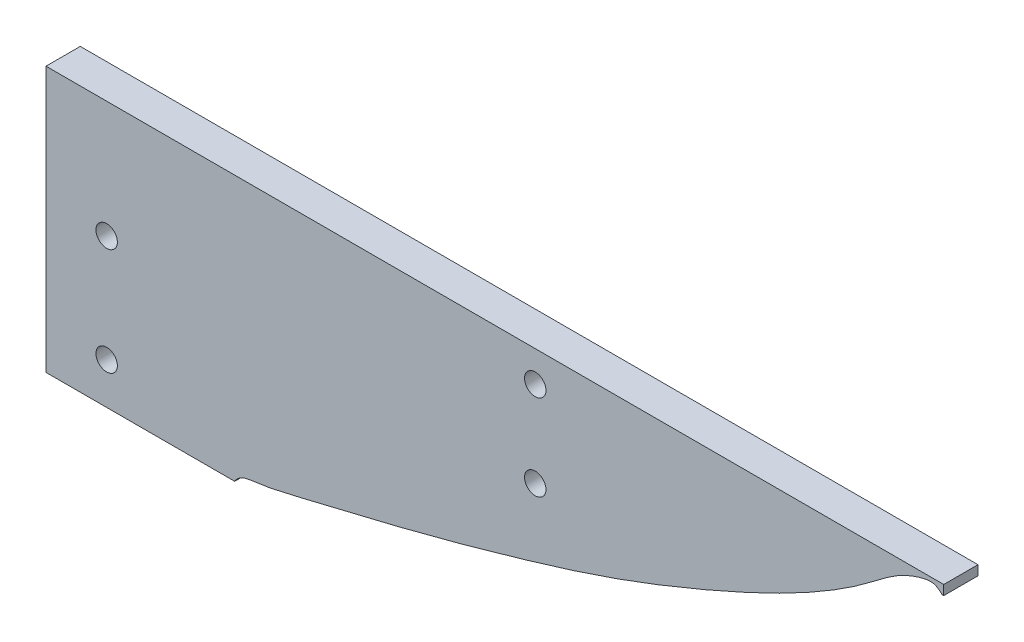
ISO-10303-21;
HEADER;
FILE_DESCRIPTION(('STEP AP214'),'2;1');
FILE_NAME('part.step','',(''),(''),'','','');
FILE_SCHEMA(('AUTOMOTIVE_DESIGN { 1 0 10303 214 1 1 1 1 }'));
ENDSEC;
DATA;
#1=APPLICATION_CONTEXT('core data for automotive mechanical design processes');
#2=APPLICATION_PROTOCOL_DEFINITION('international standard','automotive_design',2000,#1);
#3=PRODUCT_CONTEXT('',#1,'mechanical');
#4=PRODUCT('Part','Part','',(#3));
#5=PRODUCT_RELATED_PRODUCT_CATEGORY('part','',(#4));
#6=PRODUCT_DEFINITION_FORMATION('','',#4);
#7=PRODUCT_DEFINITION_CONTEXT('part definition',#1,'design');
#8=PRODUCT_DEFINITION('design','',#6,#7);
#9=PRODUCT_DEFINITION_SHAPE('','',#8);
#10=(LENGTH_UNIT() NAMED_UNIT(*) SI_UNIT(.MILLI.,.METRE.));
#11=(NAMED_UNIT(*) PLANE_ANGLE_UNIT() SI_UNIT($,.RADIAN.));
#12=(NAMED_UNIT(*) SI_UNIT($,.STERADIAN.) SOLID_ANGLE_UNIT());
#13=UNCERTAINTY_MEASURE_WITH_UNIT(LENGTH_MEASURE(1.E-05),#10,'distance_accuracy_value','');
#14=(GEOMETRIC_REPRESENTATION_CONTEXT(3) GLOBAL_UNCERTAINTY_ASSIGNED_CONTEXT((#13)) GLOBAL_UNIT_ASSIGNED_CONTEXT((#10,
#11,#12)) REPRESENTATION_CONTEXT('',''));
#15=CARTESIAN_POINT('',(0.,0.,0.));
#16=DIRECTION('',(0.,0.,1.));
#17=DIRECTION('',(1.,0.,0.));
#18=AXIS2_PLACEMENT_3D('',#15,#16,#17);
#19=CARTESIAN_POINT('',(-92.1335838005074,-59.6771100922641,236.));
#20=DIRECTION('',(0.,0.,-1.));
#21=DIRECTION('',(-1.,0.,0.));
#22=AXIS2_PLACEMENT_3D('',#19,#20,#21);
#23=PLANE('',#22);
#24=CARTESIAN_POINT('',(-100.,-50.,236.));
#25=DIRECTION('',(0.,0.,-1.));
#26=DIRECTION('',(-1.,0.,0.));
#27=AXIS2_PLACEMENT_3D('',#24,#25,#26);
#28=CIRCLE('',#27,2.5);
#29=CARTESIAN_POINT('',(-102.5,-50.,236.));
#30=VERTEX_POINT('',#29);
#31=EDGE_CURVE('E207',#30,#30,#28,.F.);
#32=ORIENTED_EDGE('',*,*,#31,.F.);
#33=EDGE_LOOP('',(#32));
#34=FACE_BOUND('',#33,.T.);
#35=CARTESIAN_POINT('',(0.0705666698621599,-4.96037406111782,236.));
#36=DIRECTION('',(0.,0.,-1.));
#37=DIRECTION('',(-1.,0.,0.));
#38=AXIS2_PLACEMENT_3D('',#35,#36,#37);
#39=CIRCLE('',#38,2.5);
#40=CARTESIAN_POINT('',(-2.42943333013784,-4.96037406111782,236.));
#41=VERTEX_POINT('',#40);
#42=EDGE_CURVE('E203',#41,#41,#39,.F.);
#43=ORIENTED_EDGE('',*,*,#42,.F.);
#44=EDGE_LOOP('',(#43));
#45=FACE_BOUND('',#44,.T.);
#46=CARTESIAN_POINT('',(-70.1025901875895,-59.6684176574879,236.));
#47=CARTESIAN_POINT('',(-84.7899186560649,-59.6754955178742,236.));
#48=CARTESIAN_POINT('',(-99.4772485604959,-59.6799394189889,236.));
#49=CARTESIAN_POINT('',(-114.164578566787,-59.682158270036,236.));
#50=B_SPLINE_CURVE_WITH_KNOTS('',3,(#46,#47,#48,#49),.UNSPECIFIED.,.F.,.F.,(4,4),(0.,1.),.UNSPECIFIED.);
#51=CARTESIAN_POINT('',(-114.164578566787,-59.682158270036,236.));
#52=VERTEX_POINT('',#51);
#53=CARTESIAN_POINT('',(-70.1025901875894,-59.668417657488,236.));
#54=VERTEX_POINT('',#53);
#55=EDGE_CURVE('E161',#52,#54,#50,.F.);
#56=ORIENTED_EDGE('',*,*,#55,.T.);
#57=CARTESIAN_POINT('',(95.0098967569557,-1.11062960043984E-13,236.));
#58=CARTESIAN_POINT('',(94.9646348912785,0.110528165147327,236.));
#59=CARTESIAN_POINT('',(94.8858730942533,0.201338484194809,236.));
#60=CARTESIAN_POINT('',(94.707948532264,0.357925164368955,236.));
#61=CARTESIAN_POINT('',(94.6121065440396,0.426979239515736,236.));
#62=CARTESIAN_POINT('',(94.3258286318335,0.635817566425945,236.));
#63=CARTESIAN_POINT('',(94.1394870668036,0.781789145604218,236.));
#64=CARTESIAN_POINT('',(93.8389060311838,0.970306379640372,236.));
#65=CARTESIAN_POINT('',(93.7367966341006,1.02877239486765,236.));
#66=CARTESIAN_POINT('',(93.5254089320287,1.12933976440624,236.));
#67=CARTESIAN_POINT('',(93.4157519255615,1.17057664656028,236.));
#68=CARTESIAN_POINT('',(93.1889723611007,1.23600859349705,236.));
#69=CARTESIAN_POINT('',(93.0717956642538,1.2602257044401,236.));
#70=CARTESIAN_POINT('',(92.8387829712304,1.29371998452372,236.));
#71=CARTESIAN_POINT('',(92.7219141891853,1.30335606876022,236.));
#72=CARTESIAN_POINT('',(92.370530206683,1.31700694439368,236.));
#73=CARTESIAN_POINT('',(92.134388676331,1.30626586552627,236.));
#74=CARTESIAN_POINT('',(91.6651232386488,1.26320279822102,236.));
#75=CARTESIAN_POINT('',(91.4329447789381,1.23192509387219,236.));
#76=CARTESIAN_POINT('',(90.7425854142331,1.11356625325394,236.));
#77=CARTESIAN_POINT('',(90.2907662999897,1.00122164833865,236.));
#78=CARTESIAN_POINT('',(88.9471475329473,0.617175365341938,236.));
#79=CARTESIAN_POINT('',(88.0630947138927,0.293935829080739,236.));
#80=CARTESIAN_POINT('',(86.354647861762,-0.442154647152451,236.));
#81=CARTESIAN_POINT('',(85.5287307014704,-0.857590972166905,236.));
#82=CARTESIAN_POINT('',(83.133035651573,-2.24128095967102,236.));
#83=CARTESIAN_POINT('',(81.6414485885241,-3.34044373908866,236.));
#84=CARTESIAN_POINT('',(79.4236390416994,-5.02195426573998,236.));
#85=CARTESIAN_POINT('',(78.687085371114,-5.58678754026477,236.));
#86=CARTESIAN_POINT('',(77.2027585566427,-6.69885319920604,236.));
#87=CARTESIAN_POINT('',(76.4563045701257,-7.24818752093762,236.));
#88=CARTESIAN_POINT('',(74.1929633514125,-8.85875375730449,236.));
#89=CARTESIAN_POINT('',(72.6509541833982,-9.8807649815716,236.));
#90=CARTESIAN_POINT('',(69.5219935181907,-11.8546228858641,236.));
#91=CARTESIAN_POINT('',(67.9355503859993,-12.80726323189,236.));
#92=CARTESIAN_POINT('',(64.7298052508904,-14.6612442309594,236.));
#93=CARTESIAN_POINT('',(63.1100013703178,-15.5620888409973,236.));
#94=CARTESIAN_POINT('',(59.8370994369851,-17.3106264463568,236.));
#95=CARTESIAN_POINT('',(58.1870022863528,-18.1576003044908,236.));
#96=CARTESIAN_POINT('',(54.865297217835,-19.8085224246815,236.));
#97=CARTESIAN_POINT('',(53.1936533501743,-20.6126409497683,236.));
#98=CARTESIAN_POINT('',(49.8357054322329,-22.1905343956482,236.));
#99=CARTESIAN_POINT('',(48.1499613025603,-22.9638846339254,236.));
#100=CARTESIAN_POINT('',(43.0750662037871,-25.2432456536307,236.));
#101=CARTESIAN_POINT('',(39.6688273042364,-26.7098908626203,236.));
#102=CARTESIAN_POINT('',(32.8179285862304,-29.5546707690006,236.));
#103=CARTESIAN_POINT('',(29.3729537534523,-30.9332543927951,236.));
#104=CARTESIAN_POINT('',(22.441303784926,-33.5782241800503,236.));
#105=CARTESIAN_POINT('',(18.9518243120829,-34.8402287007629,236.));
#106=CARTESIAN_POINT('',(11.9327285142029,-37.236064589227,236.));
#107=CARTESIAN_POINT('',(8.40266147210957,-38.3716393149871,236.));
#108=CARTESIAN_POINT('',(1.31631471382787,-40.5631469191048,236.));
#109=CARTESIAN_POINT('',(-2.2389650556304,-41.6222062183926,236.));
#110=CARTESIAN_POINT('',(-9.36163748023725,-43.6942731896203,236.));
#111=CARTESIAN_POINT('',(-12.9294966205001,-44.707455214369,236.));
#112=CARTESIAN_POINT('',(-20.0819381780462,-46.6752334090556,236.));
#113=CARTESIAN_POINT('',(-23.6667096442574,-47.6291582090685,236.));
#114=CARTESIAN_POINT('',(-34.4424742352563,-50.4058260472047,236.));
#115=CARTESIAN_POINT('',(-41.6551264096028,-52.1441386894933,236.));
#116=CARTESIAN_POINT('',(-50.6722184590445,-54.309039395931,236.));
#117=CARTESIAN_POINT('',(-52.4760057514306,-54.7405027829286,236.));
#118=CARTESIAN_POINT('',(-55.1833790678676,-55.3805250229289,236.));
#119=CARTESIAN_POINT('',(-56.0861252476857,-55.5926445734478,236.));
#120=CARTESIAN_POINT('',(-57.8921506389536,-56.0146266742834,236.));
#121=CARTESIAN_POINT('',(-58.7948901230761,-56.2269085061191,236.));
#122=CARTESIAN_POINT('',(-60.6039265474955,-56.634904518819,236.));
#123=CARTESIAN_POINT('',(-61.5108628096882,-56.8276542929522,236.));
#124=CARTESIAN_POINT('',(-62.8802997978888,-57.0747613259844,236.));
#125=CARTESIAN_POINT('',(-63.3382214245906,-57.150421442323,236.));
#126=CARTESIAN_POINT('',(-64.2569213186157,-57.2871155661889,236.));
#127=CARTESIAN_POINT('',(-64.7182060518271,-57.345783776302,236.));
#128=CARTESIAN_POINT('',(-65.6420492864172,-57.4567481160613,236.));
#129=CARTESIAN_POINT('',(-66.1039394129418,-57.5123878198849,236.));
#130=CARTESIAN_POINT('',(-67.0196061106396,-57.6642556398476,236.));
#131=CARTESIAN_POINT('',(-67.4743218544864,-57.7557855039794,236.));
#132=CARTESIAN_POINT('',(-68.1398061915465,-57.9760688859622,236.));
#133=CARTESIAN_POINT('',(-68.3587343136876,-58.0640040066889,236.));
#134=CARTESIAN_POINT('',(-68.6796419539271,-58.2333484384033,236.));
#135=CARTESIAN_POINT('',(-68.7851365366851,-58.296219802004,236.));
#136=CARTESIAN_POINT('',(-68.9848123366182,-58.4320827070422,236.));
#137=CARTESIAN_POINT('',(-69.0801823846164,-58.5053113500221,236.));
#138=CARTESIAN_POINT('',(-69.3575456460325,-58.7353677888363,236.));
#139=CARTESIAN_POINT('',(-69.5279401697686,-58.9059472641748,236.));
#140=CARTESIAN_POINT('',(-69.7801517860728,-59.165824085469,236.));
#141=CARTESIAN_POINT('',(-69.8633981038015,-59.2538774120878,236.));
#142=CARTESIAN_POINT('',(-70.0117362489369,-59.4444338368955,236.));
#143=CARTESIAN_POINT('',(-70.0755741246069,-59.550308596245,236.));
#144=CARTESIAN_POINT('',(-70.1025901875894,-59.668417657488,236.));
#145=B_SPLINE_CURVE_WITH_KNOTS('',3,(#57,#58,#59,#60,#61,#62,#63,#64,#65,#66,#67,#68,#69,#70,
#71,#72,#73,#74,#75,#76,#77,#78,#79,#80,#81,#82,#83,#84,#85,#86,#87,#88,#89,#90,#91,#92,#93,#94,
#95,#96,#97,#98,#99,#100,#101,#102,#103,#104,#105,#106,#107,#108,#109,#110,#111,#112,#113,#114,
#115,#116,#117,#118,#119,#120,#121,#122,#123,#124,#125,#126,#127,#128,#129,#130,#131,#132,#133,
#134,#135,#136,#137,#138,#139,#140,#141,#142,#143,#144),.UNSPECIFIED.,.F.,.F.,(4,2,2,2,2,2,2,2,
2,2,2,2,2,2,2,2,2,2,2,2,2,2,2,2,2,2,2,2,2,2,2,2,2,2,2,2,2,2,2,2,2,2,2,4),(0.,
0.00195312499999978,0.00390624999999956,0.00781249999999933,0.00976562499999922,
0.0117187499999991,0.013671874999999,0.0156249999999989,0.0195312499999989,0.0234374999999989,
0.0312499999999989,0.0468749999999989,0.0624999999999989,0.0937499999999987,0.109374999999999,
0.124999999999998,0.156249999999998,0.187499999999998,0.218749999999998,0.249999999999998,
0.281249999999999,0.312499999999999,0.374999999999999,0.437499999999999,0.499999999999999,
0.562499999999999,0.624999999999999,0.687499999999999,0.749999999999999,0.875,0.90625,0.921875,
0.9375,0.953125,0.9609375,0.96875,0.9765625,0.984375,0.98828125,0.990234375,0.9921875,
0.99609375,0.998046875,1.),.UNSPECIFIED.);
#146=CARTESIAN_POINT('',(95.0098967569557,0.,236.));
#147=VERTEX_POINT('',#146);
#148=EDGE_CURVE('E88',#54,#147,#145,.F.);
#149=ORIENTED_EDGE('',*,*,#148,.T.);
#150=DIRECTION('',(1.,0.,0.));
#151=VECTOR('',#150,1.);
#152=CARTESIAN_POINT('',(95.0098967569557,0.,236.));
#153=LINE('',#152,#151);
#154=CARTESIAN_POINT('',(95.44895417216,0.,236.));
#155=VERTEX_POINT('',#154);
#156=EDGE_CURVE('E102',#147,#155,#153,.T.);
#157=ORIENTED_EDGE('',*,*,#156,.T.);
#158=DIRECTION('',(0.,1.,0.));
#159=VECTOR('',#158,1.);
#160=CARTESIAN_POINT('',(95.44895417216,2.25600000000004,236.));
#161=LINE('',#160,#159);
#162=CARTESIAN_POINT('',(95.44895417216,2.25600000000004,236.));
#163=VERTEX_POINT('',#162);
#164=EDGE_CURVE('E96',#155,#163,#161,.T.);
#165=ORIENTED_EDGE('',*,*,#164,.T.);
#166=DIRECTION('',(-1.,0.,0.));
#167=VECTOR('',#166,1.);
#168=CARTESIAN_POINT('',(95.44895417216,2.25600000000004,236.));
#169=LINE('',#168,#167);
#170=CARTESIAN_POINT('',(-114.164578566787,2.25600000000002,236.));
#171=VERTEX_POINT('',#170);
#172=EDGE_CURVE('E100',#163,#171,#169,.T.);
#173=ORIENTED_EDGE('',*,*,#172,.T.);
#174=DIRECTION('',(0.,-1.,0.));
#175=VECTOR('',#174,1.);
#176=CARTESIAN_POINT('',(-114.164578566787,-59.682158270036,236.));
#177=LINE('',#176,#175);
#178=EDGE_CURVE('E51',#171,#52,#177,.T.);
#179=ORIENTED_EDGE('',*,*,#178,.T.);
#180=EDGE_LOOP('',(#56,#149,#157,#165,#173,#179));
#181=FACE_BOUND('',#180,.T.);
#182=CARTESIAN_POINT('',(0.0705666698621599,-25.,236.));
#183=DIRECTION('',(0.,0.,-1.));
#184=DIRECTION('',(-1.,0.,0.));
#185=AXIS2_PLACEMENT_3D('',#182,#183,#184);
#186=CIRCLE('',#185,2.5);
#187=CARTESIAN_POINT('',(-2.42943333013784,-25.,236.));
#188=VERTEX_POINT('',#187);
#189=EDGE_CURVE('E204',#188,#188,#186,.F.);
#190=ORIENTED_EDGE('',*,*,#189,.F.);
#191=EDGE_LOOP('',(#190));
#192=FACE_BOUND('',#191,.T.);
#193=CARTESIAN_POINT('',(-100.,-25.,236.));
#194=DIRECTION('',(0.,0.,-1.));
#195=DIRECTION('',(-1.,0.,0.));
#196=AXIS2_PLACEMENT_3D('',#193,#194,#195);
#197=CIRCLE('',#196,2.5);
#198=CARTESIAN_POINT('',(-102.5,-25.,236.));
#199=VERTEX_POINT('',#198);
#200=EDGE_CURVE('E210',#199,#199,#197,.F.);
#201=ORIENTED_EDGE('',*,*,#200,.F.);
#202=EDGE_LOOP('',(#201));
#203=FACE_BOUND('',#202,.T.);
#204=ADVANCED_FACE('F30',(#34,#45,#181,#192,#203),#23,.F.);
#205=CARTESIAN_POINT('',(-92.1335838005074,-59.6771100922641,228.));
#206=DIRECTION('',(0.,0.,-1.));
#207=DIRECTION('',(-1.,0.,0.));
#208=AXIS2_PLACEMENT_3D('',#205,#206,#207);
#209=PLANE('',#208);
#210=CARTESIAN_POINT('',(-100.,-50.,228.));
#211=DIRECTION('',(0.,0.,-1.));
#212=DIRECTION('',(-1.,0.,0.));
#213=AXIS2_PLACEMENT_3D('',#210,#211,#212);
#214=CIRCLE('',#213,2.5);
#215=CARTESIAN_POINT('',(-102.5,-50.,228.));
#216=VERTEX_POINT('',#215);
#217=EDGE_CURVE('E208',#216,#216,#214,.F.);
#218=ORIENTED_EDGE('',*,*,#217,.T.);
#219=EDGE_LOOP('',(#218));
#220=FACE_BOUND('',#219,.T.);
#221=CARTESIAN_POINT('',(0.0705666698621599,-4.96037406111782,228.));
#222=DIRECTION('',(0.,0.,-1.));
#223=DIRECTION('',(-1.,0.,0.));
#224=AXIS2_PLACEMENT_3D('',#221,#222,#223);
#225=CIRCLE('',#224,2.5);
#226=CARTESIAN_POINT('',(-2.42943333013784,-4.96037406111782,228.));
#227=VERTEX_POINT('',#226);
#228=EDGE_CURVE('E200',#227,#227,#225,.F.);
#229=ORIENTED_EDGE('',*,*,#228,.T.);
#230=EDGE_LOOP('',(#229));
#231=FACE_BOUND('',#230,.T.);
#232=CARTESIAN_POINT('',(-114.164578566787,-59.682158270036,228.));
#233=CARTESIAN_POINT('',(-99.4772485604959,-59.6799394189889,228.));
#234=CARTESIAN_POINT('',(-84.7899186560649,-59.6754955178742,228.));
#235=CARTESIAN_POINT('',(-70.1025901875895,-59.6684176574879,228.));
#236=B_SPLINE_CURVE_WITH_KNOTS('',3,(#232,#233,#234,#235),.UNSPECIFIED.,.F.,.F.,(4,4),(0.,1.),.UNSPECIFIED.);
#237=CARTESIAN_POINT('',(-114.164578566787,-59.682158270036,228.));
#238=VERTEX_POINT('',#237);
#239=CARTESIAN_POINT('',(-70.1025901875894,-59.668417657488,228.));
#240=VERTEX_POINT('',#239);
#241=EDGE_CURVE('E178',#238,#240,#236,.T.);
#242=ORIENTED_EDGE('',*,*,#241,.F.);
#243=DIRECTION('',(0.,-1.,0.));
#244=VECTOR('',#243,1.);
#245=CARTESIAN_POINT('',(-114.164578566787,-59.682158270036,228.));
#246=LINE('',#245,#244);
#247=CARTESIAN_POINT('',(-114.164578566787,2.25600000000002,228.));
#248=VERTEX_POINT('',#247);
#249=EDGE_CURVE('E80',#248,#238,#246,.T.);
#250=ORIENTED_EDGE('',*,*,#249,.F.);
#251=DIRECTION('',(-1.,0.,0.));
#252=VECTOR('',#251,1.);
#253=CARTESIAN_POINT('',(95.44895417216,2.25600000000004,228.));
#254=LINE('',#253,#252);
#255=CARTESIAN_POINT('',(95.44895417216,2.25600000000004,228.));
#256=VERTEX_POINT('',#255);
#257=EDGE_CURVE('E74',#256,#248,#254,.T.);
#258=ORIENTED_EDGE('',*,*,#257,.F.);
#259=DIRECTION('',(0.,1.,0.));
#260=VECTOR('',#259,1.);
#261=CARTESIAN_POINT('',(95.44895417216,2.25600000000004,228.));
#262=LINE('',#261,#260);
#263=CARTESIAN_POINT('',(95.44895417216,0.,228.));
#264=VERTEX_POINT('',#263);
#265=EDGE_CURVE('E110',#264,#256,#262,.T.);
#266=ORIENTED_EDGE('',*,*,#265,.F.);
#267=DIRECTION('',(1.,0.,0.));
#268=VECTOR('',#267,1.);
#269=CARTESIAN_POINT('',(95.0098967569557,0.,228.));
#270=LINE('',#269,#268);
#271=CARTESIAN_POINT('',(95.0098967569557,0.,228.));
#272=VERTEX_POINT('',#271);
#273=EDGE_CURVE('E121',#272,#264,#270,.T.);
#274=ORIENTED_EDGE('',*,*,#273,.F.);
#275=CARTESIAN_POINT('',(-70.1025901875894,-59.668417657488,228.));
#276=CARTESIAN_POINT('',(-70.0755741246069,-59.550308596245,228.));
#277=CARTESIAN_POINT('',(-70.0117362489369,-59.4444338368955,228.));
#278=CARTESIAN_POINT('',(-69.8633981038015,-59.2538774120878,228.));
#279=CARTESIAN_POINT('',(-69.7801517860728,-59.165824085469,228.));
#280=CARTESIAN_POINT('',(-69.5279401697686,-58.9059472641748,228.));
#281=CARTESIAN_POINT('',(-69.3575456460325,-58.7353677888363,228.));
#282=CARTESIAN_POINT('',(-69.0801823846164,-58.5053113500221,228.));
#283=CARTESIAN_POINT('',(-68.9848123366182,-58.4320827070422,228.));
#284=CARTESIAN_POINT('',(-68.7851365366851,-58.296219802004,228.));
#285=CARTESIAN_POINT('',(-68.6796419539271,-58.2333484384033,228.));
#286=CARTESIAN_POINT('',(-68.3587343136876,-58.0640040066889,228.));
#287=CARTESIAN_POINT('',(-68.1398061915465,-57.9760688859622,228.));
#288=CARTESIAN_POINT('',(-67.4743218544864,-57.7557855039794,228.));
#289=CARTESIAN_POINT('',(-67.0196061106396,-57.6642556398476,228.));
#290=CARTESIAN_POINT('',(-66.1039394129418,-57.5123878198849,228.));
#291=CARTESIAN_POINT('',(-65.6420492864172,-57.4567481160613,228.));
#292=CARTESIAN_POINT('',(-64.7182060518271,-57.345783776302,228.));
#293=CARTESIAN_POINT('',(-64.2569213186157,-57.2871155661889,228.));
#294=CARTESIAN_POINT('',(-63.3382214245906,-57.150421442323,228.));
#295=CARTESIAN_POINT('',(-62.8802997978888,-57.0747613259844,228.));
#296=CARTESIAN_POINT('',(-61.5108628096882,-56.8276542929522,228.));
#297=CARTESIAN_POINT('',(-60.6039265474955,-56.634904518819,228.));
#298=CARTESIAN_POINT('',(-58.7948901230761,-56.2269085061191,228.));
#299=CARTESIAN_POINT('',(-57.8921506389536,-56.0146266742834,228.));
#300=CARTESIAN_POINT('',(-56.0861252476857,-55.5926445734478,228.));
#301=CARTESIAN_POINT('',(-55.1833790678676,-55.3805250229289,228.));
#302=CARTESIAN_POINT('',(-52.4760057514306,-54.7405027829286,228.));
#303=CARTESIAN_POINT('',(-50.6722184590445,-54.309039395931,228.));
#304=CARTESIAN_POINT('',(-41.6551264096028,-52.1441386894933,228.));
#305=CARTESIAN_POINT('',(-34.4424742352563,-50.4058260472047,228.));
#306=CARTESIAN_POINT('',(-23.6667096442574,-47.6291582090685,228.));
#307=CARTESIAN_POINT('',(-20.0819381780462,-46.6752334090556,228.));
#308=CARTESIAN_POINT('',(-12.9294966205001,-44.707455214369,228.));
#309=CARTESIAN_POINT('',(-9.36163748023725,-43.6942731896203,228.));
#310=CARTESIAN_POINT('',(-2.2389650556304,-41.6222062183926,228.));
#311=CARTESIAN_POINT('',(1.31631471382787,-40.5631469191048,228.));
#312=CARTESIAN_POINT('',(8.40266147210957,-38.3716393149871,228.));
#313=CARTESIAN_POINT('',(11.9327285142029,-37.236064589227,228.));
#314=CARTESIAN_POINT('',(18.9518243120829,-34.8402287007629,228.));
#315=CARTESIAN_POINT('',(22.441303784926,-33.5782241800503,228.));
#316=CARTESIAN_POINT('',(29.3729537534523,-30.9332543927951,228.));
#317=CARTESIAN_POINT('',(32.8179285862304,-29.5546707690006,228.));
#318=CARTESIAN_POINT('',(39.6688273042364,-26.7098908626203,228.));
#319=CARTESIAN_POINT('',(43.0750662037871,-25.2432456536307,228.));
#320=CARTESIAN_POINT('',(48.1499613025603,-22.9638846339254,228.));
#321=CARTESIAN_POINT('',(49.8357054322329,-22.1905343956482,228.));
#322=CARTESIAN_POINT('',(53.1936533501743,-20.6126409497683,228.));
#323=CARTESIAN_POINT('',(54.865297217835,-19.8085224246815,228.));
#324=CARTESIAN_POINT('',(58.1870022863528,-18.1576003044908,228.));
#325=CARTESIAN_POINT('',(59.8370994369851,-17.3106264463568,228.));
#326=CARTESIAN_POINT('',(63.1100013703178,-15.5620888409973,228.));
#327=CARTESIAN_POINT('',(64.7298052508904,-14.6612442309594,228.));
#328=CARTESIAN_POINT('',(67.9355503859993,-12.80726323189,228.));
#329=CARTESIAN_POINT('',(69.5219935181907,-11.8546228858641,228.));
#330=CARTESIAN_POINT('',(72.6509541833982,-9.8807649815716,228.));
#331=CARTESIAN_POINT('',(74.1929633514125,-8.85875375730449,228.));
#332=CARTESIAN_POINT('',(76.4563045701257,-7.24818752093762,228.));
#333=CARTESIAN_POINT('',(77.2027585566427,-6.69885319920604,228.));
#334=CARTESIAN_POINT('',(78.687085371114,-5.58678754026477,228.));
#335=CARTESIAN_POINT('',(79.4236390416994,-5.02195426573998,228.));
#336=CARTESIAN_POINT('',(81.6414485885241,-3.34044373908866,228.));
#337=CARTESIAN_POINT('',(83.133035651573,-2.24128095967102,228.));
#338=CARTESIAN_POINT('',(85.5287307014704,-0.857590972166905,228.));
#339=CARTESIAN_POINT('',(86.354647861762,-0.442154647152451,228.));
#340=CARTESIAN_POINT('',(88.0630947138927,0.293935829080739,228.));
#341=CARTESIAN_POINT('',(88.9471475329473,0.617175365341938,228.));
#342=CARTESIAN_POINT('',(90.2907662999897,1.00122164833865,228.));
#343=CARTESIAN_POINT('',(90.7425854142331,1.11356625325394,228.));
#344=CARTESIAN_POINT('',(91.4329447789381,1.23192509387219,228.));
#345=CARTESIAN_POINT('',(91.6651232386488,1.26320279822102,228.));
#346=CARTESIAN_POINT('',(92.134388676331,1.30626586552627,228.));
#347=CARTESIAN_POINT('',(92.370530206683,1.31700694439368,228.));
#348=CARTESIAN_POINT('',(92.7219141891853,1.30335606876022,228.));
#349=CARTESIAN_POINT('',(92.8387829712304,1.29371998452372,228.));
#350=CARTESIAN_POINT('',(93.0717956642538,1.2602257044401,228.));
#351=CARTESIAN_POINT('',(93.1889723611007,1.23600859349705,228.));
#352=CARTESIAN_POINT('',(93.4157519255615,1.17057664656028,228.));
#353=CARTESIAN_POINT('',(93.5254089320287,1.12933976440624,228.));
#354=CARTESIAN_POINT('',(93.7367966341006,1.02877239486765,228.));
#355=CARTESIAN_POINT('',(93.8389060311838,0.970306379640372,228.));
#356=CARTESIAN_POINT('',(94.1394870668036,0.781789145604218,228.));
#357=CARTESIAN_POINT('',(94.3258286318335,0.635817566425945,228.));
#358=CARTESIAN_POINT('',(94.6121065440396,0.426979239515736,228.));
#359=CARTESIAN_POINT('',(94.707948532264,0.357925164368955,228.));
#360=CARTESIAN_POINT('',(94.8858730942533,0.201338484194809,228.));
#361=CARTESIAN_POINT('',(94.9646348912785,0.110528165147327,228.));
#362=CARTESIAN_POINT('',(95.0098967569557,-1.11062960043984E-13,228.));
#363=B_SPLINE_CURVE_WITH_KNOTS('',3,(#275,#276,#277,#278,#279,#280,#281,#282,#283,#284,#285,
#286,#287,#288,#289,#290,#291,#292,#293,#294,#295,#296,#297,#298,#299,#300,#301,#302,#303,#304,
#305,#306,#307,#308,#309,#310,#311,#312,#313,#314,#315,#316,#317,#318,#319,#320,#321,#322,#323,
#324,#325,#326,#327,#328,#329,#330,#331,#332,#333,#334,#335,#336,#337,#338,#339,#340,#341,#342,
#343,#344,#345,#346,#347,#348,#349,#350,#351,#352,#353,#354,#355,#356,#357,#358,#359,#360,#361,
#362),.UNSPECIFIED.,.F.,.F.,(4,2,2,2,2,2,2,2,2,2,2,2,2,2,2,2,2,2,2,2,2,2,2,2,2,2,2,2,2,2,2,2,2,
2,2,2,2,2,2,2,2,2,2,4),(0.,0.00195312500000011,0.00390625000000011,0.0078125,
0.00976562500000011,0.01171875,0.015625,0.0234375,0.0312500000000001,0.0390625000000002,
0.0468750000000002,0.0625000000000003,0.0781250000000003,0.0937500000000003,0.125,
0.250000000000001,0.312500000000001,0.375000000000001,0.437500000000001,0.500000000000001,
0.562500000000001,0.625000000000001,0.687500000000001,0.718750000000001,0.750000000000002,
0.781250000000002,0.812500000000002,0.843750000000002,0.875000000000002,0.890625000000001,
0.906250000000001,0.937500000000001,0.953125000000001,0.968750000000001,0.976562500000001,
0.980468750000001,0.984375000000001,0.986328125000001,0.988281250000001,0.990234375000001,
0.992187500000001,0.99609375,0.998046875,1.),.UNSPECIFIED.);
#364=EDGE_CURVE('E258',#240,#272,#363,.T.);
#365=ORIENTED_EDGE('',*,*,#364,.F.);
#366=EDGE_LOOP('',(#242,#250,#258,#266,#274,#365));
#367=FACE_BOUND('',#366,.T.);
#368=CARTESIAN_POINT('',(0.0705666698621599,-25.,228.));
#369=DIRECTION('',(0.,0.,-1.));
#370=DIRECTION('',(-1.,0.,0.));
#371=AXIS2_PLACEMENT_3D('',#368,#369,#370);
#372=CIRCLE('',#371,2.5);
#373=CARTESIAN_POINT('',(-2.42943333013784,-25.,228.));
#374=VERTEX_POINT('',#373);
#375=EDGE_CURVE('E205',#374,#374,#372,.F.);
#376=ORIENTED_EDGE('',*,*,#375,.T.);
#377=EDGE_LOOP('',(#376));
#378=FACE_BOUND('',#377,.T.);
#379=CARTESIAN_POINT('',(-100.,-25.,228.));
#380=DIRECTION('',(0.,0.,-1.));
#381=DIRECTION('',(-1.,0.,0.));
#382=AXIS2_PLACEMENT_3D('',#379,#380,#381);
#383=CIRCLE('',#382,2.5);
#384=CARTESIAN_POINT('',(-102.5,-25.,228.));
#385=VERTEX_POINT('',#384);
#386=EDGE_CURVE('E36',#385,#385,#383,.F.);
#387=ORIENTED_EDGE('',*,*,#386,.T.);
#388=EDGE_LOOP('',(#387));
#389=FACE_BOUND('',#388,.T.);
#390=ADVANCED_FACE('F139',(#220,#231,#367,#378,#389),#209,.T.);
#391=CARTESIAN_POINT('',(-114.164578566787,-59.682158270036,236.));
#392=CARTESIAN_POINT('',(-99.4772485604959,-59.6799394189889,236.));
#393=CARTESIAN_POINT('',(-84.7899186560649,-59.6754955178742,236.));
#394=CARTESIAN_POINT('',(-70.1025901875895,-59.6684176574879,236.));
#395=B_SPLINE_CURVE_WITH_KNOTS('',3,(#391,#392,#393,#394),.UNSPECIFIED.,.F.,.F.,(4,4),(0.,1.),.UNSPECIFIED.);
#396=DIRECTION('',(0.,0.,-1.));
#397=VECTOR('',#396,1.);
#398=SURFACE_OF_LINEAR_EXTRUSION('',#395,#397);
#399=ORIENTED_EDGE('',*,*,#241,.T.);
#400=DIRECTION('',(0.,0.,-1.));
#401=VECTOR('',#400,1.);
#402=CARTESIAN_POINT('',(-70.1025901875894,-59.668417657488,236.));
#403=LINE('',#402,#401);
#404=EDGE_CURVE('E11',#54,#240,#403,.T.);
#405=ORIENTED_EDGE('',*,*,#404,.F.);
#406=ORIENTED_EDGE('',*,*,#55,.F.);
#407=DIRECTION('',(0.,0.,-1.));
#408=VECTOR('',#407,1.);
#409=CARTESIAN_POINT('',(-114.164578566787,-59.682158270036,236.));
#410=LINE('',#409,#408);
#411=EDGE_CURVE('E116',#52,#238,#410,.T.);
#412=ORIENTED_EDGE('',*,*,#411,.T.);
#413=EDGE_LOOP('',(#399,#405,#406,#412));
#414=FACE_BOUND('',#413,.T.);
#415=ADVANCED_FACE('F32',(#414),#398,.F.);
#416=CARTESIAN_POINT('',(-70.1025901875894,-59.668417657488,236.));
#417=CARTESIAN_POINT('',(-70.0755741246069,-59.550308596245,236.));
#418=CARTESIAN_POINT('',(-70.0117362489369,-59.4444338368955,236.));
#419=CARTESIAN_POINT('',(-69.8633981038015,-59.2538774120878,236.));
#420=CARTESIAN_POINT('',(-69.7801517860728,-59.165824085469,236.));
#421=CARTESIAN_POINT('',(-69.5279401697686,-58.9059472641748,236.));
#422=CARTESIAN_POINT('',(-69.3575456460325,-58.7353677888363,236.));
#423=CARTESIAN_POINT('',(-69.0801823846164,-58.5053113500221,236.));
#424=CARTESIAN_POINT('',(-68.9848123366182,-58.4320827070422,236.));
#425=CARTESIAN_POINT('',(-68.7851365366851,-58.296219802004,236.));
#426=CARTESIAN_POINT('',(-68.6796419539271,-58.2333484384033,236.));
#427=CARTESIAN_POINT('',(-68.3587343136876,-58.0640040066889,236.));
#428=CARTESIAN_POINT('',(-68.1398061915465,-57.9760688859622,236.));
#429=CARTESIAN_POINT('',(-67.4743218544864,-57.7557855039794,236.));
#430=CARTESIAN_POINT('',(-67.0196061106396,-57.6642556398476,236.));
#431=CARTESIAN_POINT('',(-66.1039394129418,-57.5123878198849,236.));
#432=CARTESIAN_POINT('',(-65.6420492864172,-57.4567481160613,236.));
#433=CARTESIAN_POINT('',(-64.7182060518271,-57.345783776302,236.));
#434=CARTESIAN_POINT('',(-64.2569213186157,-57.2871155661889,236.));
#435=CARTESIAN_POINT('',(-63.3382214245906,-57.150421442323,236.));
#436=CARTESIAN_POINT('',(-62.8802997978888,-57.0747613259844,236.));
#437=CARTESIAN_POINT('',(-61.5108628096882,-56.8276542929522,236.));
#438=CARTESIAN_POINT('',(-60.6039265474955,-56.634904518819,236.));
#439=CARTESIAN_POINT('',(-58.7948901230761,-56.2269085061191,236.));
#440=CARTESIAN_POINT('',(-57.8921506389536,-56.0146266742834,236.));
#441=CARTESIAN_POINT('',(-56.0861252476857,-55.5926445734478,236.));
#442=CARTESIAN_POINT('',(-55.1833790678676,-55.3805250229289,236.));
#443=CARTESIAN_POINT('',(-52.4760057514306,-54.7405027829286,236.));
#444=CARTESIAN_POINT('',(-50.6722184590445,-54.309039395931,236.));
#445=CARTESIAN_POINT('',(-41.6551264096028,-52.1441386894933,236.));
#446=CARTESIAN_POINT('',(-34.4424742352563,-50.4058260472047,236.));
#447=CARTESIAN_POINT('',(-23.6667096442574,-47.6291582090685,236.));
#448=CARTESIAN_POINT('',(-20.0819381780462,-46.6752334090556,236.));
#449=CARTESIAN_POINT('',(-12.9294966205001,-44.707455214369,236.));
#450=CARTESIAN_POINT('',(-9.36163748023725,-43.6942731896203,236.));
#451=CARTESIAN_POINT('',(-2.2389650556304,-41.6222062183926,236.));
#452=CARTESIAN_POINT('',(1.31631471382787,-40.5631469191048,236.));
#453=CARTESIAN_POINT('',(8.40266147210957,-38.3716393149871,236.));
#454=CARTESIAN_POINT('',(11.9327285142029,-37.236064589227,236.));
#455=CARTESIAN_POINT('',(18.9518243120829,-34.8402287007629,236.));
#456=CARTESIAN_POINT('',(22.441303784926,-33.5782241800503,236.));
#457=CARTESIAN_POINT('',(29.3729537534523,-30.9332543927951,236.));
#458=CARTESIAN_POINT('',(32.8179285862304,-29.5546707690006,236.));
#459=CARTESIAN_POINT('',(39.6688273042364,-26.7098908626203,236.));
#460=CARTESIAN_POINT('',(43.0750662037871,-25.2432456536307,236.));
#461=CARTESIAN_POINT('',(48.1499613025603,-22.9638846339254,236.));
#462=CARTESIAN_POINT('',(49.8357054322329,-22.1905343956482,236.));
#463=CARTESIAN_POINT('',(53.1936533501743,-20.6126409497683,236.));
#464=CARTESIAN_POINT('',(54.865297217835,-19.8085224246815,236.));
#465=CARTESIAN_POINT('',(58.1870022863528,-18.1576003044908,236.));
#466=CARTESIAN_POINT('',(59.8370994369851,-17.3106264463568,236.));
#467=CARTESIAN_POINT('',(63.1100013703178,-15.5620888409973,236.));
#468=CARTESIAN_POINT('',(64.7298052508904,-14.6612442309594,236.));
#469=CARTESIAN_POINT('',(67.9355503859993,-12.80726323189,236.));
#470=CARTESIAN_POINT('',(69.5219935181907,-11.8546228858641,236.));
#471=CARTESIAN_POINT('',(72.6509541833982,-9.8807649815716,236.));
#472=CARTESIAN_POINT('',(74.1929633514125,-8.85875375730449,236.));
#473=CARTESIAN_POINT('',(76.4563045701257,-7.24818752093762,236.));
#474=CARTESIAN_POINT('',(77.2027585566427,-6.69885319920604,236.));
#475=CARTESIAN_POINT('',(78.687085371114,-5.58678754026477,236.));
#476=CARTESIAN_POINT('',(79.4236390416994,-5.02195426573998,236.));
#477=CARTESIAN_POINT('',(81.6414485885241,-3.34044373908866,236.));
#478=CARTESIAN_POINT('',(83.133035651573,-2.24128095967102,236.));
#479=CARTESIAN_POINT('',(85.5287307014704,-0.857590972166905,236.));
#480=CARTESIAN_POINT('',(86.354647861762,-0.442154647152451,236.));
#481=CARTESIAN_POINT('',(88.0630947138927,0.293935829080739,236.));
#482=CARTESIAN_POINT('',(88.9471475329473,0.617175365341938,236.));
#483=CARTESIAN_POINT('',(90.2907662999897,1.00122164833865,236.));
#484=CARTESIAN_POINT('',(90.7425854142331,1.11356625325394,236.));
#485=CARTESIAN_POINT('',(91.4329447789381,1.23192509387219,236.));
#486=CARTESIAN_POINT('',(91.6651232386488,1.26320279822102,236.));
#487=CARTESIAN_POINT('',(92.134388676331,1.30626586552627,236.));
#488=CARTESIAN_POINT('',(92.370530206683,1.31700694439368,236.));
#489=CARTESIAN_POINT('',(92.7219141891853,1.30335606876022,236.));
#490=CARTESIAN_POINT('',(92.8387829712304,1.29371998452372,236.));
#491=CARTESIAN_POINT('',(93.0717956642538,1.2602257044401,236.));
#492=CARTESIAN_POINT('',(93.1889723611007,1.23600859349705,236.));
#493=CARTESIAN_POINT('',(93.4157519255615,1.17057664656028,236.));
#494=CARTESIAN_POINT('',(93.5254089320287,1.12933976440624,236.));
#495=CARTESIAN_POINT('',(93.7367966341006,1.02877239486765,236.));
#496=CARTESIAN_POINT('',(93.8389060311838,0.970306379640372,236.));
#497=CARTESIAN_POINT('',(94.1394870668036,0.781789145604218,236.));
#498=CARTESIAN_POINT('',(94.3258286318335,0.635817566425945,236.));
#499=CARTESIAN_POINT('',(94.6121065440396,0.426979239515736,236.));
#500=CARTESIAN_POINT('',(94.707948532264,0.357925164368955,236.));
#501=CARTESIAN_POINT('',(94.8858730942533,0.201338484194809,236.));
#502=CARTESIAN_POINT('',(94.9646348912785,0.110528165147327,236.));
#503=CARTESIAN_POINT('',(95.0098967569557,-1.11062960043984E-13,236.));
#504=B_SPLINE_CURVE_WITH_KNOTS('',3,(#416,#417,#418,#419,#420,#421,#422,#423,#424,#425,#426,
#427,#428,#429,#430,#431,#432,#433,#434,#435,#436,#437,#438,#439,#440,#441,#442,#443,#444,#445,
#446,#447,#448,#449,#450,#451,#452,#453,#454,#455,#456,#457,#458,#459,#460,#461,#462,#463,#464,
#465,#466,#467,#468,#469,#470,#471,#472,#473,#474,#475,#476,#477,#478,#479,#480,#481,#482,#483,
#484,#485,#486,#487,#488,#489,#490,#491,#492,#493,#494,#495,#496,#497,#498,#499,#500,#501,#502,
#503),.UNSPECIFIED.,.F.,.F.,(4,2,2,2,2,2,2,2,2,2,2,2,2,2,2,2,2,2,2,2,2,2,2,2,2,2,2,2,2,2,2,2,2,
2,2,2,2,2,2,2,2,2,2,4),(0.,0.00195312500000011,0.00390625000000011,0.0078125,
0.00976562500000011,0.01171875,0.015625,0.0234375,0.0312500000000001,0.0390625000000002,
0.0468750000000002,0.0625000000000003,0.0781250000000003,0.0937500000000003,0.125,
0.250000000000001,0.312500000000001,0.375000000000001,0.437500000000001,0.500000000000001,
0.562500000000001,0.625000000000001,0.687500000000001,0.718750000000001,0.750000000000002,
0.781250000000002,0.812500000000002,0.843750000000002,0.875000000000002,0.890625000000001,
0.906250000000001,0.937500000000001,0.953125000000001,0.968750000000001,0.976562500000001,
0.980468750000001,0.984375000000001,0.986328125000001,0.988281250000001,0.990234375000001,
0.992187500000001,0.99609375,0.998046875,1.),.UNSPECIFIED.);
#505=DIRECTION('',(0.,0.,-1.));
#506=VECTOR('',#505,1.);
#507=SURFACE_OF_LINEAR_EXTRUSION('',#504,#506);
#508=ORIENTED_EDGE('',*,*,#364,.T.);
#509=DIRECTION('',(0.,0.,-1.));
#510=VECTOR('',#509,1.);
#511=CARTESIAN_POINT('',(95.0098967569557,0.,236.));
#512=LINE('',#511,#510);
#513=EDGE_CURVE('E42',#147,#272,#512,.T.);
#514=ORIENTED_EDGE('',*,*,#513,.F.);
#515=ORIENTED_EDGE('',*,*,#148,.F.);
#516=ORIENTED_EDGE('',*,*,#404,.T.);
#517=EDGE_LOOP('',(#508,#514,#515,#516));
#518=FACE_BOUND('',#517,.T.);
#519=ADVANCED_FACE('F236',(#518),#507,.F.);
#520=CARTESIAN_POINT('',(95.0098967569557,0.,236.));
#521=DIRECTION('',(0.,1.,0.));
#522=DIRECTION('',(-1.,0.,0.));
#523=AXIS2_PLACEMENT_3D('',#520,#521,#522);
#524=PLANE('',#523);
#525=ORIENTED_EDGE('',*,*,#273,.T.);
#526=DIRECTION('',(0.,0.,-1.));
#527=VECTOR('',#526,1.);
#528=CARTESIAN_POINT('',(95.44895417216,0.,236.));
#529=LINE('',#528,#527);
#530=EDGE_CURVE('E111',#155,#264,#529,.T.);
#531=ORIENTED_EDGE('',*,*,#530,.F.);
#532=ORIENTED_EDGE('',*,*,#156,.F.);
#533=ORIENTED_EDGE('',*,*,#513,.T.);
#534=EDGE_LOOP('',(#525,#531,#532,#533));
#535=FACE_BOUND('',#534,.T.);
#536=ADVANCED_FACE('F240',(#535),#524,.F.);
#537=CARTESIAN_POINT('',(95.44895417216,2.25600000000004,236.));
#538=DIRECTION('',(-1.,0.,0.));
#539=DIRECTION('',(0.,-1.,0.));
#540=AXIS2_PLACEMENT_3D('',#537,#538,#539);
#541=PLANE('',#540);
#542=ORIENTED_EDGE('',*,*,#265,.T.);
#543=DIRECTION('',(0.,0.,-1.));
#544=VECTOR('',#543,1.);
#545=CARTESIAN_POINT('',(95.44895417216,2.25600000000004,236.));
#546=LINE('',#545,#544);
#547=EDGE_CURVE('E107',#163,#256,#546,.T.);
#548=ORIENTED_EDGE('',*,*,#547,.F.);
#549=ORIENTED_EDGE('',*,*,#164,.F.);
#550=ORIENTED_EDGE('',*,*,#530,.T.);
#551=EDGE_LOOP('',(#542,#548,#549,#550));
#552=FACE_BOUND('',#551,.T.);
#553=ADVANCED_FACE('F108',(#552),#541,.F.);
#554=CARTESIAN_POINT('',(95.44895417216,2.25600000000004,236.));
#555=DIRECTION('',(0.,-1.,0.));
#556=DIRECTION('',(1.,0.,0.));
#557=AXIS2_PLACEMENT_3D('',#554,#555,#556);
#558=PLANE('',#557);
#559=ORIENTED_EDGE('',*,*,#257,.T.);
#560=DIRECTION('',(0.,0.,-1.));
#561=VECTOR('',#560,1.);
#562=CARTESIAN_POINT('',(-114.164578566787,2.25600000000002,236.));
#563=LINE('',#562,#561);
#564=EDGE_CURVE('E112',#171,#248,#563,.T.);
#565=ORIENTED_EDGE('',*,*,#564,.F.);
#566=ORIENTED_EDGE('',*,*,#172,.F.);
#567=ORIENTED_EDGE('',*,*,#547,.T.);
#568=EDGE_LOOP('',(#559,#565,#566,#567));
#569=FACE_BOUND('',#568,.T.);
#570=ADVANCED_FACE('F114',(#569),#558,.F.);
#571=CARTESIAN_POINT('',(-114.164578566787,-59.682158270036,236.));
#572=DIRECTION('',(1.,0.,0.));
#573=DIRECTION('',(0.,1.,0.));
#574=AXIS2_PLACEMENT_3D('',#571,#572,#573);
#575=PLANE('',#574);
#576=ORIENTED_EDGE('',*,*,#249,.T.);
#577=ORIENTED_EDGE('',*,*,#411,.F.);
#578=ORIENTED_EDGE('',*,*,#178,.F.);
#579=ORIENTED_EDGE('',*,*,#564,.T.);
#580=EDGE_LOOP('',(#576,#577,#578,#579));
#581=FACE_BOUND('',#580,.T.);
#582=ADVANCED_FACE('F292',(#581),#575,.F.);
#583=CARTESIAN_POINT('',(0.0705666698621599,-4.96037406111782,308.));
#584=DIRECTION('',(0.,0.,-1.));
#585=DIRECTION('',(-1.,0.,0.));
#586=AXIS2_PLACEMENT_3D('',#583,#584,#585);
#587=CYLINDRICAL_SURFACE('',#586,2.5);
#588=ORIENTED_EDGE('',*,*,#228,.F.);
#589=EDGE_LOOP('',(#588));
#590=FACE_BOUND('',#589,.T.);
#591=ORIENTED_EDGE('',*,*,#42,.T.);
#592=EDGE_LOOP('',(#591));
#593=FACE_BOUND('',#592,.T.);
#594=ADVANCED_FACE('F141',(#590,#593),#587,.F.);
#595=CARTESIAN_POINT('',(0.0705666698621599,-25.,308.));
#596=DIRECTION('',(0.,0.,-1.));
#597=DIRECTION('',(-1.,0.,0.));
#598=AXIS2_PLACEMENT_3D('',#595,#596,#597);
#599=CYLINDRICAL_SURFACE('',#598,2.5);
#600=ORIENTED_EDGE('',*,*,#375,.F.);
#601=EDGE_LOOP('',(#600));
#602=FACE_BOUND('',#601,.T.);
#603=ORIENTED_EDGE('',*,*,#189,.T.);
#604=EDGE_LOOP('',(#603));
#605=FACE_BOUND('',#604,.T.);
#606=ADVANCED_FACE('F284',(#602,#605),#599,.F.);
#607=CARTESIAN_POINT('',(-100.,-50.,308.));
#608=DIRECTION('',(0.,0.,-1.));
#609=DIRECTION('',(-1.,0.,0.));
#610=AXIS2_PLACEMENT_3D('',#607,#608,#609);
#611=CYLINDRICAL_SURFACE('',#610,2.5);
#612=ORIENTED_EDGE('',*,*,#217,.F.);
#613=EDGE_LOOP('',(#612));
#614=FACE_BOUND('',#613,.T.);
#615=ORIENTED_EDGE('',*,*,#31,.T.);
#616=EDGE_LOOP('',(#615));
#617=FACE_BOUND('',#616,.T.);
#618=ADVANCED_FACE('F279',(#614,#617),#611,.F.);
#619=CARTESIAN_POINT('',(-100.,-25.,308.));
#620=DIRECTION('',(0.,0.,-1.));
#621=DIRECTION('',(-1.,0.,0.));
#622=AXIS2_PLACEMENT_3D('',#619,#620,#621);
#623=CYLINDRICAL_SURFACE('',#622,2.5);
#624=ORIENTED_EDGE('',*,*,#386,.F.);
#625=EDGE_LOOP('',(#624));
#626=FACE_BOUND('',#625,.T.);
#627=ORIENTED_EDGE('',*,*,#200,.T.);
#628=EDGE_LOOP('',(#627));
#629=FACE_BOUND('',#628,.T.);
#630=ADVANCED_FACE('F277',(#626,#629),#623,.F.);
#631=CLOSED_SHELL('',(#204,#390,#415,#519,#536,#553,#570,#582,#594,#606,#618,#630));
#632=MANIFOLD_SOLID_BREP('B2',#631);
#633=ADVANCED_BREP_SHAPE_REPRESENTATION('',(#18,#632),#14);
#634=SHAPE_DEFINITION_REPRESENTATION(#9,#633);
ENDSEC;
END-ISO-10303-21;
